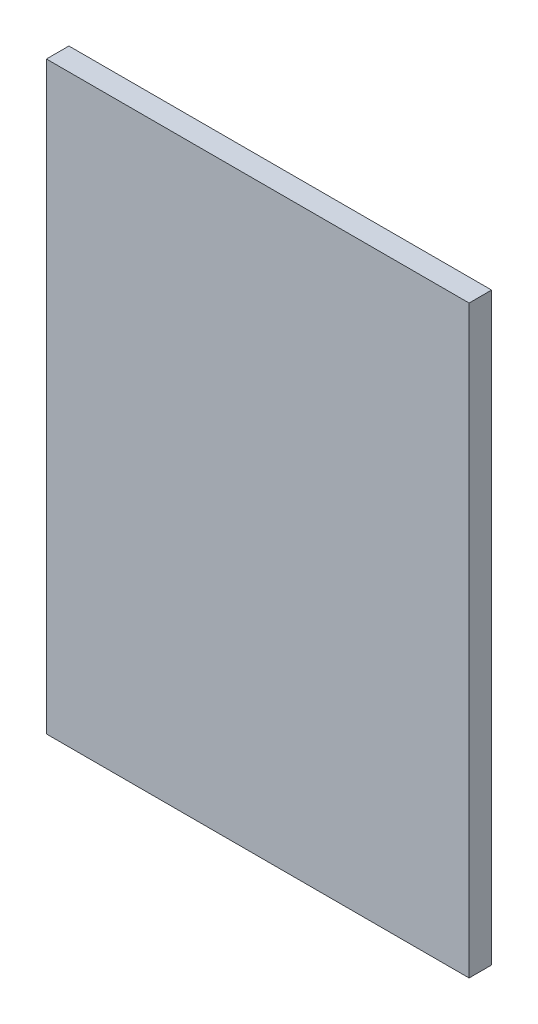
ISO-10303-21;
HEADER;
FILE_DESCRIPTION(('STEP AP214'),'2;1');
FILE_NAME('part.step','',(''),(''),'','','');
FILE_SCHEMA(('AUTOMOTIVE_DESIGN { 1 0 10303 214 1 1 1 1 }'));
ENDSEC;
DATA;
#1=APPLICATION_CONTEXT('core data for automotive mechanical design processes');
#2=APPLICATION_PROTOCOL_DEFINITION('international standard','automotive_design',2000,#1);
#3=PRODUCT_CONTEXT('',#1,'mechanical');
#4=PRODUCT('Part','Part','',(#3));
#5=PRODUCT_RELATED_PRODUCT_CATEGORY('part','',(#4));
#6=PRODUCT_DEFINITION_FORMATION('','',#4);
#7=PRODUCT_DEFINITION_CONTEXT('part definition',#1,'design');
#8=PRODUCT_DEFINITION('design','',#6,#7);
#9=PRODUCT_DEFINITION_SHAPE('','',#8);
#10=(LENGTH_UNIT() NAMED_UNIT(*) SI_UNIT(.MILLI.,.METRE.));
#11=(NAMED_UNIT(*) PLANE_ANGLE_UNIT() SI_UNIT($,.RADIAN.));
#12=(NAMED_UNIT(*) SI_UNIT($,.STERADIAN.) SOLID_ANGLE_UNIT());
#13=UNCERTAINTY_MEASURE_WITH_UNIT(LENGTH_MEASURE(1.E-05),#10,'distance_accuracy_value','');
#14=(GEOMETRIC_REPRESENTATION_CONTEXT(3) GLOBAL_UNCERTAINTY_ASSIGNED_CONTEXT((#13)) GLOBAL_UNIT_ASSIGNED_CONTEXT((#10,
#11,#12)) REPRESENTATION_CONTEXT('',''));
#15=CARTESIAN_POINT('',(0.,0.,0.));
#16=DIRECTION('',(0.,0.,1.));
#17=DIRECTION('',(1.,0.,0.));
#18=AXIS2_PLACEMENT_3D('',#15,#16,#17);
#19=CARTESIAN_POINT('',(-11.2302560725,-4.27023566285372,9.99999999999998));
#20=DIRECTION('',(-1.,0.,0.));
#21=DIRECTION('',(0.,-1.,0.));
#22=AXIS2_PLACEMENT_3D('',#19,#20,#21);
#23=PLANE('',#22);
#24=DIRECTION('',(0.,1.,0.));
#25=VECTOR('',#24,1.);
#26=CARTESIAN_POINT('',(-11.2302560725,-4.27023566285372,4.99999999999998));
#27=LINE('',#26,#25);
#28=CARTESIAN_POINT('',(-11.2302560725,-4.27023566285372,4.99999999999998));
#29=VERTEX_POINT('',#28);
#30=CARTESIAN_POINT('',(-11.2302560725005,125.729764337146,4.99999999999998));
#31=VERTEX_POINT('',#30);
#32=EDGE_CURVE('E95',#29,#31,#27,.T.);
#33=ORIENTED_EDGE('',*,*,#32,.T.);
#34=DIRECTION('',(0.,0.,-1.));
#35=VECTOR('',#34,1.);
#36=CARTESIAN_POINT('',(-11.2302560725005,125.729764337146,9.99999999999998));
#37=LINE('',#36,#35);
#38=CARTESIAN_POINT('',(-11.2302560725005,125.729764337146,9.99999999999998));
#39=VERTEX_POINT('',#38);
#40=EDGE_CURVE('E11',#39,#31,#37,.T.);
#41=ORIENTED_EDGE('',*,*,#40,.F.);
#42=DIRECTION('',(0.,1.,0.));
#43=VECTOR('',#42,1.);
#44=CARTESIAN_POINT('',(-11.2302560725,-4.27023566285372,9.99999999999998));
#45=LINE('',#44,#43);
#46=CARTESIAN_POINT('',(-11.2302560725,-4.27023566285372,9.99999999999998));
#47=VERTEX_POINT('',#46);
#48=EDGE_CURVE('E83',#47,#39,#45,.T.);
#49=ORIENTED_EDGE('',*,*,#48,.F.);
#50=DIRECTION('',(0.,0.,-1.));
#51=VECTOR('',#50,1.);
#52=CARTESIAN_POINT('',(-11.2302560725,-4.27023566285372,9.99999999999998));
#53=LINE('',#52,#51);
#54=EDGE_CURVE('E91',#47,#29,#53,.T.);
#55=ORIENTED_EDGE('',*,*,#54,.T.);
#56=EDGE_LOOP('',(#33,#41,#49,#55));
#57=FACE_BOUND('',#56,.T.);
#58=ADVANCED_FACE('F32',(#57),#23,.F.);
#59=CARTESIAN_POINT('',(-11.2302560725005,125.729764337146,9.99999999999998));
#60=DIRECTION('',(0.,-1.,0.));
#61=DIRECTION('',(1.,0.,0.));
#62=AXIS2_PLACEMENT_3D('',#59,#60,#61);
#63=PLANE('',#62);
#64=DIRECTION('',(-1.,0.,0.));
#65=VECTOR('',#64,1.);
#66=CARTESIAN_POINT('',(-11.2302560725005,125.729764337146,4.99999999999998));
#67=LINE('',#66,#65);
#68=CARTESIAN_POINT('',(-105.2302560725,125.729764337146,4.99999999999998));
#69=VERTEX_POINT('',#68);
#70=EDGE_CURVE('E87',#31,#69,#67,.T.);
#71=ORIENTED_EDGE('',*,*,#70,.T.);
#72=DIRECTION('',(0.,0.,-1.));
#73=VECTOR('',#72,1.);
#74=CARTESIAN_POINT('',(-105.2302560725,125.729764337146,9.99999999999998));
#75=LINE('',#74,#73);
#76=CARTESIAN_POINT('',(-105.2302560725,125.729764337146,9.99999999999998));
#77=VERTEX_POINT('',#76);
#78=EDGE_CURVE('E40',#77,#69,#75,.T.);
#79=ORIENTED_EDGE('',*,*,#78,.F.);
#80=DIRECTION('',(-1.,0.,0.));
#81=VECTOR('',#80,1.);
#82=CARTESIAN_POINT('',(-11.2302560725005,125.729764337146,9.99999999999998));
#83=LINE('',#82,#81);
#84=EDGE_CURVE('E78',#39,#77,#83,.T.);
#85=ORIENTED_EDGE('',*,*,#84,.F.);
#86=ORIENTED_EDGE('',*,*,#40,.T.);
#87=EDGE_LOOP('',(#71,#79,#85,#86));
#88=FACE_BOUND('',#87,.T.);
#89=ADVANCED_FACE('F86',(#88),#63,.F.);
#90=CARTESIAN_POINT('',(-105.2302560725,-4.27023566285405,9.99999999999998));
#91=DIRECTION('',(1.,0.,0.));
#92=DIRECTION('',(0.,1.,0.));
#93=AXIS2_PLACEMENT_3D('',#90,#91,#92);
#94=PLANE('',#93);
#95=DIRECTION('',(0.,-1.,0.));
#96=VECTOR('',#95,1.);
#97=CARTESIAN_POINT('',(-105.2302560725,-4.27023566285405,4.99999999999998));
#98=LINE('',#97,#96);
#99=CARTESIAN_POINT('',(-105.2302560725,-4.27023566285405,4.99999999999998));
#100=VERTEX_POINT('',#99);
#101=EDGE_CURVE('E65',#69,#100,#98,.T.);
#102=ORIENTED_EDGE('',*,*,#101,.T.);
#103=DIRECTION('',(0.,0.,-1.));
#104=VECTOR('',#103,1.);
#105=CARTESIAN_POINT('',(-105.2302560725,-4.27023566285405,9.99999999999998));
#106=LINE('',#105,#104);
#107=CARTESIAN_POINT('',(-105.2302560725,-4.27023566285405,9.99999999999998));
#108=VERTEX_POINT('',#107);
#109=EDGE_CURVE('E88',#108,#100,#106,.T.);
#110=ORIENTED_EDGE('',*,*,#109,.F.);
#111=DIRECTION('',(0.,-1.,0.));
#112=VECTOR('',#111,1.);
#113=CARTESIAN_POINT('',(-105.2302560725,-4.27023566285405,9.99999999999998));
#114=LINE('',#113,#112);
#115=EDGE_CURVE('E81',#77,#108,#114,.T.);
#116=ORIENTED_EDGE('',*,*,#115,.F.);
#117=ORIENTED_EDGE('',*,*,#78,.T.);
#118=EDGE_LOOP('',(#102,#110,#116,#117));
#119=FACE_BOUND('',#118,.T.);
#120=ADVANCED_FACE('F89',(#119),#94,.F.);
#121=CARTESIAN_POINT('',(-11.2302560725,-4.27023566285372,9.99999999999998));
#122=DIRECTION('',(0.,1.,0.));
#123=DIRECTION('',(-1.,0.,0.));
#124=AXIS2_PLACEMENT_3D('',#121,#122,#123);
#125=PLANE('',#124);
#126=DIRECTION('',(1.,0.,0.));
#127=VECTOR('',#126,1.);
#128=CARTESIAN_POINT('',(-11.2302560725,-4.27023566285372,4.99999999999998));
#129=LINE('',#128,#127);
#130=EDGE_CURVE('E71',#100,#29,#129,.T.);
#131=ORIENTED_EDGE('',*,*,#130,.T.);
#132=ORIENTED_EDGE('',*,*,#54,.F.);
#133=DIRECTION('',(1.,0.,0.));
#134=VECTOR('',#133,1.);
#135=CARTESIAN_POINT('',(-11.2302560725,-4.27023566285372,9.99999999999998));
#136=LINE('',#135,#134);
#137=EDGE_CURVE('E48',#108,#47,#136,.T.);
#138=ORIENTED_EDGE('',*,*,#137,.F.);
#139=ORIENTED_EDGE('',*,*,#109,.T.);
#140=EDGE_LOOP('',(#131,#132,#138,#139));
#141=FACE_BOUND('',#140,.T.);
#142=ADVANCED_FACE('F102',(#141),#125,.F.);
#143=CARTESIAN_POINT('',(0.,0.,9.99999999999998));
#144=DIRECTION('',(0.,0.,1.));
#145=DIRECTION('',(1.,0.,0.));
#146=AXIS2_PLACEMENT_3D('',#143,#144,#145);
#147=PLANE('',#146);
#148=ORIENTED_EDGE('',*,*,#48,.T.);
#149=ORIENTED_EDGE('',*,*,#84,.T.);
#150=ORIENTED_EDGE('',*,*,#115,.T.);
#151=ORIENTED_EDGE('',*,*,#137,.T.);
#152=EDGE_LOOP('',(#148,#149,#150,#151));
#153=FACE_BOUND('',#152,.T.);
#154=ADVANCED_FACE('F79',(#153),#147,.T.);
#155=CARTESIAN_POINT('',(0.,0.,4.99999999999998));
#156=DIRECTION('',(0.,0.,1.));
#157=DIRECTION('',(1.,0.,0.));
#158=AXIS2_PLACEMENT_3D('',#155,#156,#157);
#159=PLANE('',#158);
#160=ORIENTED_EDGE('',*,*,#32,.F.);
#161=ORIENTED_EDGE('',*,*,#130,.F.);
#162=ORIENTED_EDGE('',*,*,#101,.F.);
#163=ORIENTED_EDGE('',*,*,#70,.F.);
#164=EDGE_LOOP('',(#160,#161,#162,#163));
#165=FACE_BOUND('',#164,.T.);
#166=ADVANCED_FACE('F105',(#165),#159,.F.);
#167=CLOSED_SHELL('',(#58,#89,#120,#142,#154,#166));
#168=MANIFOLD_SOLID_BREP('B2',#167);
#169=ADVANCED_BREP_SHAPE_REPRESENTATION('',(#18,#168),#14);
#170=SHAPE_DEFINITION_REPRESENTATION(#9,#169);
ENDSEC;
END-ISO-10303-21;
